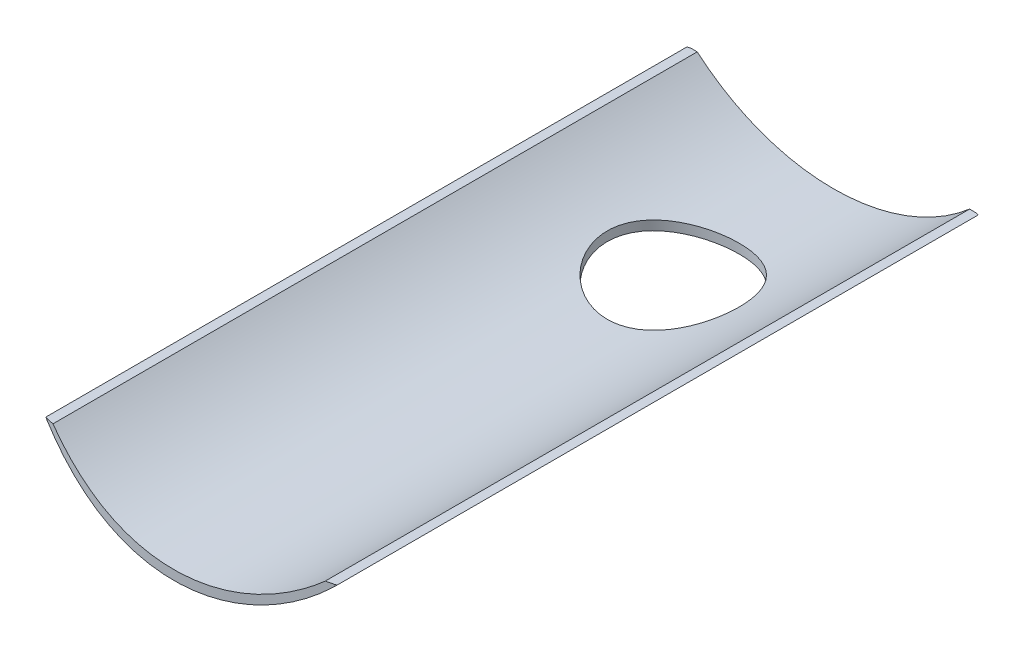
ISO-10303-21;
HEADER;
FILE_DESCRIPTION(('STEP AP214'),'2;1');
FILE_NAME('part.step','',(''),(''),'','','');
FILE_SCHEMA(('AUTOMOTIVE_DESIGN { 1 0 10303 214 1 1 1 1 }'));
ENDSEC;
DATA;
#1=APPLICATION_CONTEXT('core data for automotive mechanical design processes');
#2=APPLICATION_PROTOCOL_DEFINITION('international standard','automotive_design',2000,#1);
#3=PRODUCT_CONTEXT('',#1,'mechanical');
#4=PRODUCT('Part','Part','',(#3));
#5=PRODUCT_RELATED_PRODUCT_CATEGORY('part','',(#4));
#6=PRODUCT_DEFINITION_FORMATION('','',#4);
#7=PRODUCT_DEFINITION_CONTEXT('part definition',#1,'design');
#8=PRODUCT_DEFINITION('design','',#6,#7);
#9=PRODUCT_DEFINITION_SHAPE('','',#8);
#10=(LENGTH_UNIT() NAMED_UNIT(*) SI_UNIT(.MILLI.,.METRE.));
#11=(NAMED_UNIT(*) PLANE_ANGLE_UNIT() SI_UNIT($,.RADIAN.));
#12=(NAMED_UNIT(*) SI_UNIT($,.STERADIAN.) SOLID_ANGLE_UNIT());
#13=UNCERTAINTY_MEASURE_WITH_UNIT(LENGTH_MEASURE(1.E-05),#10,'distance_accuracy_value','');
#14=(GEOMETRIC_REPRESENTATION_CONTEXT(3) GLOBAL_UNCERTAINTY_ASSIGNED_CONTEXT((#13)) GLOBAL_UNIT_ASSIGNED_CONTEXT((#10,
#11,#12)) REPRESENTATION_CONTEXT('',''));
#15=CARTESIAN_POINT('',(0.,0.,0.));
#16=DIRECTION('',(0.,0.,1.));
#17=DIRECTION('',(1.,0.,0.));
#18=AXIS2_PLACEMENT_3D('',#15,#16,#17);
#19=CARTESIAN_POINT('',(0.,-14.5,-9.));
#20=DIRECTION('',(0.,1.,0.));
#21=DIRECTION('',(0.,0.,1.));
#22=AXIS2_PLACEMENT_3D('',#19,#20,#21);
#23=CYLINDRICAL_SURFACE('',#22,3.5);
#24=CARTESIAN_POINT('',(0.,5.32088476061199,-5.5));
#25=CARTESIAN_POINT('',(-0.191526825834939,5.3208855065018,-5.50000093821887));
#26=CARTESIAN_POINT('',(-0.383063894433787,5.32589674768476,-5.51577278943595));
#27=CARTESIAN_POINT('',(-0.760530324365489,5.34539621708635,-5.57827381732667));
#28=CARTESIAN_POINT('',(-0.946458516996928,5.35988640632481,-5.62500939985183));
#29=CARTESIAN_POINT('',(-1.30720975958481,5.39676213968765,-5.74770010129213));
#30=CARTESIAN_POINT('',(-1.48204971827713,5.41913530373675,-5.82360942023109));
#31=CARTESIAN_POINT('',(-1.81651915442775,5.46947108764902,-6.00229603900988));
#32=CARTESIAN_POINT('',(-1.97614613074492,5.49743462428307,-6.10507774653204));
#33=CARTESIAN_POINT('',(-2.28068338402112,5.55697131709403,-6.33799583710389));
#34=CARTESIAN_POINT('',(-2.42504777548865,5.58862436266948,-6.46882545344545));
#35=CARTESIAN_POINT('',(-2.69019437924349,5.65151354058959,-6.75264990998738));
#36=CARTESIAN_POINT('',(-2.81097208119303,5.68274959213322,-6.90564897979135));
#37=CARTESIAN_POINT('',(-3.02850100142779,5.74212871768421,-7.23422438442751));
#38=CARTESIAN_POINT('',(-3.12456597116331,5.77017337954669,-7.41027451729348));
#39=CARTESIAN_POINT('',(-3.2854976617757,5.81879077365608,-7.7770605121669));
#40=CARTESIAN_POINT('',(-3.35037280179967,5.83936552190752,-7.96779239494863));
#41=CARTESIAN_POINT('',(-3.44507790445037,5.86987702786242,-8.35235999308716));
#42=CARTESIAN_POINT('',(-3.47592213511352,5.88012083710118,-8.54592088426397));
#43=CARTESIAN_POINT('',(-3.50485893311831,5.88972175462142,-8.93572046630378));
#44=CARTESIAN_POINT('',(-3.50296042278065,5.88908182869607,-9.13195841311174));
#45=CARTESIAN_POINT('',(-3.46725801547015,5.87725830750563,-9.51311183171549));
#46=CARTESIAN_POINT('',(-3.43474870405648,5.86650255025182,-9.69816408372934));
#47=CARTESIAN_POINT('',(-3.34084851920821,5.8363550911236,-10.0600401906554));
#48=CARTESIAN_POINT('',(-3.27945451614662,5.81696245346413,-10.2368631516504));
#49=CARTESIAN_POINT('',(-3.12862403734678,5.77140204125633,-10.5803228877669));
#50=CARTESIAN_POINT('',(-3.03878467028114,5.74513793258776,-10.7467694049594));
#51=CARTESIAN_POINT('',(-2.83389344514333,5.68883742615724,-11.0626467921691));
#52=CARTESIAN_POINT('',(-2.71883492019947,5.65880003179719,-11.2120731468764));
#53=CARTESIAN_POINT('',(-2.46043996037277,5.59662620637496,-11.496980621167));
#54=CARTESIAN_POINT('',(-2.31603638283043,5.56445715828589,-11.6314885969967));
#55=CARTESIAN_POINT('',(-2.00632231296585,5.5028764827965,-11.874618494683));
#56=CARTESIAN_POINT('',(-1.84101020610866,5.47346506864353,-11.9832384156204));
#57=CARTESIAN_POINT('',(-1.49226692494624,5.42039319930235,-12.1721873106183));
#58=CARTESIAN_POINT('',(-1.30869968860249,5.39678131453562,-12.2522797217186));
#59=CARTESIAN_POINT('',(-0.92977762373222,5.3583197872143,-12.38015718643));
#60=CARTESIAN_POINT('',(-0.734426475031878,5.34346742473038,-12.4279522693944));
#61=CARTESIAN_POINT('',(-0.345738744388238,5.32463809632502,-12.4882103164957));
#62=CARTESIAN_POINT('',(-0.152625670209283,5.32025596712989,-12.5019902890583));
#63=CARTESIAN_POINT('',(0.233176723549936,5.32165993259656,-12.4975462335547));
#64=CARTESIAN_POINT('',(0.425866102194367,5.32744450640182,-12.4793269923124));
#65=CARTESIAN_POINT('',(0.800241621256614,5.34826545972186,-12.4124567399101));
#66=CARTESIAN_POINT('',(0.982083035207409,5.36306226027484,-12.3645932459412));
#67=CARTESIAN_POINT('',(1.33510014929901,5.40017086876392,-12.240757773707));
#68=CARTESIAN_POINT('',(1.50627452090239,5.42248361057255,-12.1647823023499));
#69=CARTESIAN_POINT('',(1.83780297204784,5.47302001676189,-11.9847841167472));
#70=CARTESIAN_POINT('',(1.99778533245517,5.50137607467234,-11.880114954523));
#71=CARTESIAN_POINT('',(2.29835475332182,5.56076067941532,-11.6464735387647));
#72=CARTESIAN_POINT('',(2.43893642815166,5.59178996446827,-11.5174945602401));
#73=CARTESIAN_POINT('',(2.70263090815309,5.65460855108553,-11.2326995335284));
#74=CARTESIAN_POINT('',(2.82480474144142,5.68637768321683,-11.0760076344552));
#75=CARTESIAN_POINT('',(3.0412131827589,5.74576860941254,-10.7436564493548));
#76=CARTESIAN_POINT('',(3.13544814346785,5.77339045582707,-10.5679974027932));
#77=CARTESIAN_POINT('',(3.29273760882299,5.8210573993537,-10.2030003555836));
#78=CARTESIAN_POINT('',(3.35590508690303,5.84112988524341,-10.0137148295575));
#79=CARTESIAN_POINT('',(3.44923514956587,5.8712363487207,-9.62642735578938));
#80=CARTESIAN_POINT('',(3.47941064351736,5.88127425258838,-9.42842884890237));
#81=CARTESIAN_POINT('',(3.50496019909568,5.88975994433679,-9.03916890068653));
#82=CARTESIAN_POINT('',(3.50187738158904,5.88872167117601,-8.84801871546189));
#83=CARTESIAN_POINT('',(3.46473433591919,5.87642397622354,-8.46910415222743));
#84=CARTESIAN_POINT('',(3.43067561152698,5.86516505060851,-8.28133961030783));
#85=CARTESIAN_POINT('',(3.33359017040974,5.83405756828473,-7.91735079192129));
#86=CARTESIAN_POINT('',(3.27101406625686,5.8143428986887,-7.74099401342603));
#87=CARTESIAN_POINT('',(3.1190264053624,5.76858195256711,-7.40114266263042));
#88=CARTESIAN_POINT('',(3.0296093066859,5.74253436867836,-7.23765075538307));
#89=CARTESIAN_POINT('',(2.82231256862552,5.68574778189372,-6.92111702815611));
#90=CARTESIAN_POINT('',(2.70344081872265,5.65486320546763,-6.76875113502704));
#91=CARTESIAN_POINT('',(2.4423440532209,5.5925423105855,-6.48563003715149));
#92=CARTESIAN_POINT('',(2.30011273753868,5.56110584533323,-6.35488068153493));
#93=CARTESIAN_POINT('',(1.99058389206493,5.49995549662576,-6.11429988819391));
#94=CARTESIAN_POINT('',(1.82260452560217,5.47033502827467,-6.00531925836418));
#95=CARTESIAN_POINT('',(1.46977599878047,5.41734087299457,-5.81728399974068));
#96=CARTESIAN_POINT('',(1.28493314997642,5.39396486169343,-5.73821823117257));
#97=CARTESIAN_POINT('',(0.918574914925608,5.35760918433067,-5.61762661120125));
#98=CARTESIAN_POINT('',(0.737932531916937,5.34395872332752,-5.57364584072277));
#99=CARTESIAN_POINT('',(0.371529246064371,5.32559710101201,-5.51483518222499));
#100=CARTESIAN_POINT('',(0.185769441139776,5.32088403714397,-5.49999908998442));
#101=CARTESIAN_POINT('',(0.,5.32088476061199,-5.5));
#102=B_SPLINE_CURVE_WITH_KNOTS('',3,(#24,#25,#26,#27,#28,#29,#30,#31,#32,#33,#34,#35,#36,#37,
#38,#39,#40,#41,#42,#43,#44,#45,#46,#47,#48,#49,#50,#51,#52,#53,#54,#55,#56,#57,#58,#59,#60,#61,
#62,#63,#64,#65,#66,#67,#68,#69,#70,#71,#72,#73,#74,#75,#76,#77,#78,#79,#80,#81,#82,#83,#84,#85,
#86,#87,#88,#89,#90,#91,#92,#93,#94,#95,#96,#97,#98,#99,#100,#101),.UNSPECIFIED.,.T.,.F.,(4,2,2,
2,2,2,2,2,2,2,2,2,2,2,2,2,2,2,2,2,2,2,2,2,2,2,2,2,2,2,2,2,2,2,2,2,2,2,4),(0.,0.573897525283531,
1.14791381696329,1.72103261492896,2.29424547643856,2.88371787577477,3.47330288615985,
4.07782532500147,4.68218449187366,5.26799906885395,5.85365401524862,6.41560266234714,
6.9776122100376,7.54796758594675,8.11847392177906,8.71554143805597,9.31265508744797,
9.91461091567814,10.516379731369,11.0944556671152,11.6724451347368,12.2357021373134,
12.7990291516658,13.3762711074204,13.9536729845596,14.5544775151635,15.1552744613297,
15.7538702187704,16.3522316689345,16.9229543811249,17.4936493882199,18.055623611302,
18.6177139466725,19.2022002793224,19.7868445077928,20.3911397703394,20.9952097818369,
21.5519742178875,22.1086201189442),.UNSPECIFIED.);
#103=CARTESIAN_POINT('',(0.,5.32088476061199,-5.5));
#104=VERTEX_POINT('',#103);
#105=EDGE_CURVE('E50',#104,#104,#102,.T.);
#106=ORIENTED_EDGE('',*,*,#105,.F.);
#107=EDGE_LOOP('',(#106));
#108=FACE_BOUND('',#107,.T.);
#109=CARTESIAN_POINT('',(0.,4.82088476061199,-5.5));
#110=CARTESIAN_POINT('',(0.19143140653732,4.82088530448239,-5.50000064146602));
#111=CARTESIAN_POINT('',(0.382870389835319,4.82594021580945,-5.51575698658184));
#112=CARTESIAN_POINT('',(0.760137629016243,4.84560923280242,-5.57819257379226));
#113=CARTESIAN_POINT('',(0.945964817574961,4.8602251450736,-5.62487766006889));
#114=CARTESIAN_POINT('',(1.30651417107755,4.89742204187737,-5.74742753234194));
#115=CARTESIAN_POINT('',(1.48125343410955,4.91999039288335,-5.82324605311449));
#116=CARTESIAN_POINT('',(1.81553783181465,4.970770034611,-6.00171003162263));
#117=CARTESIAN_POINT('',(1.97508037769681,4.99898228425325,-6.10436004904507));
#118=CARTESIAN_POINT('',(2.27955195665395,5.05907322636459,-6.33703100777899));
#119=CARTESIAN_POINT('',(2.42392636813927,5.09103423377662,-6.46775637021229));
#120=CARTESIAN_POINT('',(2.68911858172509,5.15455102558737,-6.75136804631081));
#121=CARTESIAN_POINT('',(2.80993176539689,5.1861067294091,-6.90425869455573));
#122=CARTESIAN_POINT('',(3.02762678851305,5.24613000452591,-7.23271985378584));
#123=CARTESIAN_POINT('',(3.12380733801851,5.27449635875154,-7.40877542059871));
#124=CARTESIAN_POINT('',(3.28496283833208,5.3236870523994,-7.77561366128622));
#125=CARTESIAN_POINT('',(3.34994639753402,5.34451347197569,-7.96639225565229));
#126=CARTESIAN_POINT('',(3.44481837862392,5.3754035156368,-8.35098737683265));
#127=CARTESIAN_POINT('',(3.47573884277147,5.38578276675724,-8.54452324899824));
#128=CARTESIAN_POINT('',(3.50483184824081,5.3955393758083,-8.93429267567411));
#129=CARTESIAN_POINT('',(3.5030135123191,5.3949197985933,-9.13052546345236));
#130=CARTESIAN_POINT('',(3.46748594662404,5.383026755082,-9.51150309211028));
#131=CARTESIAN_POINT('',(3.43509896015596,5.37219503541428,-9.6963873703625));
#132=CARTESIAN_POINT('',(3.34150124202147,5.34181736549592,-10.0579471764941));
#133=CARTESIAN_POINT('',(3.2802873311514,5.32227045409507,-10.2346217966021));
#134=CARTESIAN_POINT('',(3.12986041911698,5.27633353004357,-10.5778529092077));
#135=CARTESIAN_POINT('',(3.04023933406713,5.24984482159357,-10.7442167744828));
#136=CARTESIAN_POINT('',(2.83582543515429,5.19305296398221,-11.0599733940764));
#137=CARTESIAN_POINT('',(2.72102585732247,5.16274879076515,-11.2093615716312));
#138=CARTESIAN_POINT('',(2.46306689916837,5.09997863352204,-11.4943881013466));
#139=CARTESIAN_POINT('',(2.31881908458038,5.06747835208679,-11.6290357029507));
#140=CARTESIAN_POINT('',(2.00938726007011,5.00524490931578,-11.8724758928125));
#141=CARTESIAN_POINT('',(1.84420156972368,4.9755119704129,-11.9812664038243));
#142=CARTESIAN_POINT('',(1.49561606167117,4.92182851123474,-12.1706130382226));
#143=CARTESIAN_POINT('',(1.3120747937752,4.89792870478278,-12.2509241080853));
#144=CARTESIAN_POINT('',(0.933146449037734,4.85897097587644,-12.3792328727117));
#145=CARTESIAN_POINT('',(0.737763145744489,4.8439102529591,-12.427240802699));
#146=CARTESIAN_POINT('',(0.349099950339404,4.82478227368023,-12.4878725488604));
#147=CARTESIAN_POINT('',(0.156049358786767,4.82029878033,-12.5018368358264));
#148=CARTESIAN_POINT('',(-0.229662258347909,4.82159417609271,-12.4977760923846));
#149=CARTESIAN_POINT('',(-0.422323338959801,4.82737149686179,-12.4797559507296));
#150=CARTESIAN_POINT('',(-0.796558045455255,4.84826542936773,-12.413309579564));
#151=CARTESIAN_POINT('',(-0.978289788620628,4.86313456090024,-12.3656885388519));
#152=CARTESIAN_POINT('',(-1.33112677201221,4.90046146949166,-12.242381917253));
#153=CARTESIAN_POINT('',(-1.50223068147821,4.92292019462016,-12.1666928300738));
#154=CARTESIAN_POINT('',(-1.83371445384514,4.97382409496691,-11.9872889659293));
#155=CARTESIAN_POINT('',(-1.99371941373681,5.0024048598932,-11.8829210260551));
#156=CARTESIAN_POINT('',(-2.29439021003751,5.06229254641561,-11.6499006650575));
#157=CARTESIAN_POINT('',(-2.43505057798869,5.09360023480808,-11.5212414013909));
#158=CARTESIAN_POINT('',(-2.69908492803031,5.15704703928084,-11.2369844843053));
#159=CARTESIAN_POINT('',(-2.821502963194,5.18916696474995,-11.0804925464064));
#160=CARTESIAN_POINT('',(-3.03843621942246,5.24925711546907,-10.7484907097825));
#161=CARTESIAN_POINT('',(-3.13295170356341,5.27722737984246,-10.572980990386));
#162=CARTESIAN_POINT('',(-3.29084830544772,5.32555006222802,-10.2081687740716));
#163=CARTESIAN_POINT('',(-3.35433463547186,5.3459281667198,-10.0189154217402));
#164=CARTESIAN_POINT('',(-3.44829318037467,5.37655023768649,-9.6316162582365));
#165=CARTESIAN_POINT('',(-3.47877863671414,5.38679826866704,-9.43357400680224));
#166=CARTESIAN_POINT('',(-3.5048937312197,5.39556449248371,-9.04434580437698));
#167=CARTESIAN_POINT('',(-3.50209700848726,5.39461227804356,-8.85327609800927));
#168=CARTESIAN_POINT('',(-3.46554829135386,5.38237874258789,-8.47447471010425));
#169=CARTESIAN_POINT('',(-3.43179785521035,5.37109794152931,-8.28674286101905));
#170=CARTESIAN_POINT('',(-3.33537201133704,5.33985586403609,-7.92288833091721));
#171=CARTESIAN_POINT('',(-3.27316469284128,5.32003535351685,-7.74662859048841));
#172=CARTESIAN_POINT('',(-3.12196237615671,5.27398808532218,-7.40690873123454));
#173=CARTESIAN_POINT('',(-3.03296177068228,5.24775998688675,-7.24345130070277));
#174=CARTESIAN_POINT('',(-2.82648560036826,5.19052749329312,-6.92680552509836));
#175=CARTESIAN_POINT('',(-2.70800259892487,5.15937265581369,-6.77430139245789));
#176=CARTESIAN_POINT('',(-2.44767652219913,5.09646967073046,-6.49083083667719));
#177=CARTESIAN_POINT('',(-2.30582709449918,5.06472136387206,-6.3598702897994));
#178=CARTESIAN_POINT('',(-1.99690804793316,5.00289392155277,-6.11867033919153));
#179=CARTESIAN_POINT('',(-1.82913699814338,4.97291020360634,-6.00930201971378));
#180=CARTESIAN_POINT('',(-1.47663787901487,4.91921688853666,-5.82045872368926));
#181=CARTESIAN_POINT('',(-1.29191581886499,4.89550507948593,-5.74097320413368));
#182=CARTESIAN_POINT('',(-0.924595398808691,4.85845713968989,-5.61920081125796));
#183=CARTESIAN_POINT('',(-0.74281532397621,4.84449303971511,-5.57463347090965));
#184=CARTESIAN_POINT('',(-0.374025126406755,4.82570760344303,-5.51503604378572));
#185=CARTESIAN_POINT('',(-0.187016178846452,4.82088422928556,-5.49999937332893));
#186=CARTESIAN_POINT('',(0.,4.82088476061199,-5.5));
#187=B_SPLINE_CURVE_WITH_KNOTS('',3,(#109,#110,#111,#112,#113,#114,#115,#116,#117,#118,#119,
#120,#121,#122,#123,#124,#125,#126,#127,#128,#129,#130,#131,#132,#133,#134,#135,#136,#137,#138,
#139,#140,#141,#142,#143,#144,#145,#146,#147,#148,#149,#150,#151,#152,#153,#154,#155,#156,#157,
#158,#159,#160,#161,#162,#163,#164,#165,#166,#167,#168,#169,#170,#171,#172,#173,#174,#175,#176,
#177,#178,#179,#180,#181,#182,#183,#184,#185,#186),.UNSPECIFIED.,.T.,.F.,(4,2,2,2,2,2,2,2,2,2,2,
2,2,2,2,2,2,2,2,2,2,2,2,2,2,2,2,2,2,2,2,2,2,2,2,2,2,2,4),(0.,0.57360656811535,1.14732155375981,
1.72012919423387,2.29303423976353,2.88247314904556,3.47202748318688,4.07685958214657,
4.6815246896821,5.26731778668069,5.85294765335188,6.41435357676066,6.97582142983933,
7.54575145302607,8.11583477057582,8.713008812114,9.31023081180442,9.91247361651073,
10.5145255111073,11.0924587010871,11.670303562796,12.233079312015,12.795925387519,
13.3728385829561,13.9499145302926,14.5508655494821,15.1518109024893,15.7507042108089,
16.3493571265514,16.9198217384034,17.4902576337674,18.0516302589405,18.6131204496627,
19.1973558512978,19.7817503466198,20.3863129132675,20.9906619824036,21.5511637022355,
22.1115404474654),.UNSPECIFIED.);
#188=CARTESIAN_POINT('',(0.,4.82088476061199,-5.5));
#189=VERTEX_POINT('',#188);
#190=EDGE_CURVE('E203',#189,#189,#187,.T.);
#191=ORIENTED_EDGE('',*,*,#190,.F.);
#192=EDGE_LOOP('',(#191));
#193=FACE_BOUND('',#192,.T.);
#194=ADVANCED_FACE('F45',(#108,#193),#23,.F.);
#195=CARTESIAN_POINT('',(0.,15.7960136016071,22.));
#196=DIRECTION('',(0.,0.,-1.));
#197=DIRECTION('',(-1.,0.,0.));
#198=AXIS2_PLACEMENT_3D('',#195,#196,#197);
#199=CYLINDRICAL_SURFACE('',#198,10.9751288409951);
#200=DIRECTION('',(0.,0.,-1.));
#201=VECTOR('',#200,1.);
#202=CARTESIAN_POINT('',(-7.72499999999999,8.,22.));
#203=LINE('',#202,#201);
#204=CARTESIAN_POINT('',(-7.72499999999999,8.,16.5551947380919));
#205=VERTEX_POINT('',#204);
#206=CARTESIAN_POINT('',(-7.725,8.,-17.4465142774873));
#207=VERTEX_POINT('',#206);
#208=EDGE_CURVE('E148',#205,#207,#203,.T.);
#209=ORIENTED_EDGE('',*,*,#208,.T.);
#210=CARTESIAN_POINT('',(-7.5,7.78330787404896,-17.5));
#211=CARTESIAN_POINT('',(-7.51944719464652,7.80150949658212,-17.4999953004398));
#212=CARTESIAN_POINT('',(-7.53882618738081,7.81978254185645,-17.4988654953529));
#213=CARTESIAN_POINT('',(-7.57717432151773,7.85620429238337,-17.4943836605344));
#214=CARTESIAN_POINT('',(-7.5961454182387,7.87435293587609,-17.4910478449557));
#215=CARTESIAN_POINT('',(-7.63369223155576,7.91052849504138,-17.4821811387675));
#216=CARTESIAN_POINT('',(-7.65226792008459,7.92855540201114,-17.476650092878));
#217=CARTESIAN_POINT('',(-7.6890139213376,7.96446279159413,-17.4633109194193));
#218=CARTESIAN_POINT('',(-7.70718026850482,7.9823412347136,-17.4554864106548));
#219=CARTESIAN_POINT('',(-7.725,7.99999999999999,-17.4465142774873));
#220=B_SPLINE_CURVE_WITH_KNOTS('',3,(#210,#211,#212,#213,#214,#215,#216,#217,#218,#219),
.UNSPECIFIED.,.F.,.F.,(4,2,2,2,4),(0.,0.0798835149737886,0.159186317251592,0.238494730033664,
0.3183840171239),.UNSPECIFIED.);
#221=CARTESIAN_POINT('',(-7.5,7.78330787404896,-17.5));
#222=VERTEX_POINT('',#221);
#223=EDGE_CURVE('E181',#222,#207,#220,.T.);
#224=ORIENTED_EDGE('',*,*,#223,.F.);
#225=CARTESIAN_POINT('',(0.,15.7960136016071,-17.5));
#226=DIRECTION('',(0.,0.,1.));
#227=DIRECTION('',(1.,0.,0.));
#228=AXIS2_PLACEMENT_3D('',#225,#226,#227);
#229=CIRCLE('',#228,10.9751288409951);
#230=CARTESIAN_POINT('',(7.5,7.78330787404897,-17.5));
#231=VERTEX_POINT('',#230);
#232=EDGE_CURVE('E178',#222,#231,#229,.T.);
#233=ORIENTED_EDGE('',*,*,#232,.T.);
#234=CARTESIAN_POINT('',(7.72499999999999,8.,-17.4465142774873));
#235=CARTESIAN_POINT('',(7.70718026850482,7.9823412347136,-17.4554864106548));
#236=CARTESIAN_POINT('',(7.6890139213376,7.96446279159414,-17.4633109194193));
#237=CARTESIAN_POINT('',(7.65226792008458,7.92855540201115,-17.476650092878));
#238=CARTESIAN_POINT('',(7.63369223155575,7.91052849504138,-17.4821811387675));
#239=CARTESIAN_POINT('',(7.5961454182387,7.87435293587609,-17.4910478449557));
#240=CARTESIAN_POINT('',(7.57717432151772,7.85620429238338,-17.4943836605344));
#241=CARTESIAN_POINT('',(7.5388261873808,7.81978254185645,-17.4988654953529));
#242=CARTESIAN_POINT('',(7.51944719464651,7.80150949658213,-17.4999953004398));
#243=CARTESIAN_POINT('',(7.49999999999999,7.78330787404897,-17.5));
#244=B_SPLINE_CURVE_WITH_KNOTS('',3,(#234,#235,#236,#237,#238,#239,#240,#241,#242,#243),
.UNSPECIFIED.,.F.,.F.,(4,2,2,2,4),(0.,0.0798892870902371,0.159197699872309,0.238500502150111,
0.318384017123901),.UNSPECIFIED.);
#245=CARTESIAN_POINT('',(7.72499999999999,8.,-17.4465142774873));
#246=VERTEX_POINT('',#245);
#247=EDGE_CURVE('E231',#246,#231,#244,.T.);
#248=ORIENTED_EDGE('',*,*,#247,.F.);
#249=DIRECTION('',(0.,0.,-1.));
#250=VECTOR('',#249,1.);
#251=CARTESIAN_POINT('',(7.72500000000001,8.,22.));
#252=LINE('',#251,#250);
#253=CARTESIAN_POINT('',(7.72500000000001,8.,16.5551947380919));
#254=VERTEX_POINT('',#253);
#255=EDGE_CURVE('E136',#254,#246,#252,.T.);
#256=ORIENTED_EDGE('',*,*,#255,.F.);
#257=CARTESIAN_POINT('',(7.6171875,7.89462716210885,16.5947535928015));
#258=CARTESIAN_POINT('',(7.63568150610906,7.91246140250281,16.5903167614611));
#259=CARTESIAN_POINT('',(7.65391288417226,7.93015959253265,16.5848017745608));
#260=CARTESIAN_POINT('',(7.68985038417122,7.96528387182916,16.5716154896533));
#261=CARTESIAN_POINT('',(7.70755650610802,7.98270996109637,16.5639441916504));
#262=CARTESIAN_POINT('',(7.72500000000001,8.,16.5551947380919));
#263=B_SPLINE_CURVE_WITH_KNOTS('',3,(#257,#258,#259,#260,#261,#262),.UNSPECIFIED.,.F.,.F.,(4,2,
4),(0.,0.0780013936563805,0.156002787157712),.UNSPECIFIED.);
#264=CARTESIAN_POINT('',(7.6171875,7.89462716210885,16.5947535928015));
#265=VERTEX_POINT('',#264);
#266=EDGE_CURVE('E192',#265,#254,#263,.T.);
#267=ORIENTED_EDGE('',*,*,#266,.F.);
#268=CARTESIAN_POINT('',(7.61718749999999,7.89462716210885,16.5947535928015));
#269=CARTESIAN_POINT('',(7.39792719125212,7.68322673831301,16.6476291749199));
#270=CARTESIAN_POINT('',(7.1697958519958,7.48093720283657,16.700201282834));
#271=CARTESIAN_POINT('',(6.69720156006887,7.09579702471757,16.803392180274));
#272=CARTESIAN_POINT('',(6.45273595918425,6.91294954665779,16.8540106509549));
#273=CARTESIAN_POINT('',(5.94860728198732,6.56774147266081,16.9519975777249));
#274=CARTESIAN_POINT('',(5.68892364614475,6.4054095728351,16.9993614401232));
#275=CARTESIAN_POINT('',(5.15630076288902,6.1027259982858,17.089491783541));
#276=CARTESIAN_POINT('',(4.88336237166681,5.9623729063087,17.1322585609372));
#277=CARTESIAN_POINT('',(4.32549148765708,5.70452385361387,17.2121041355063));
#278=CARTESIAN_POINT('',(4.04053880500545,5.58706839898629,17.2491728286687));
#279=CARTESIAN_POINT('',(3.46105139413115,5.3763389572589,17.3165002839755));
#280=CARTESIAN_POINT('',(3.16651707103253,5.2830639492705,17.3467593336131));
#281=CARTESIAN_POINT('',(2.57028464884705,5.12163405849708,17.3995850121112));
#282=CARTESIAN_POINT('',(2.2685941299159,5.05345375725707,17.4221594229991));
#283=CARTESIAN_POINT('',(1.66004569416219,4.94274974230408,17.4590072521946));
#284=CARTESIAN_POINT('',(1.35318799440774,4.90022495357888,17.4732810183133));
#285=CARTESIAN_POINT('',(0.747509854431837,4.84229428789005,17.4927653788695));
#286=CARTESIAN_POINT('',(0.44878469046765,4.82599012278121,17.4982761061578));
#287=CARTESIAN_POINT('',(-0.149035833103814,4.81782615269546,17.5010327411121));
#288=CARTESIAN_POINT('',(-0.448131185997268,4.82596591070833,17.4982787965345));
#289=CARTESIAN_POINT('',(-1.04453804775387,4.86661493259549,17.4845800092121));
#290=CARTESIAN_POINT('',(-1.34184913104644,4.89912979423219,17.4736332849898));
#291=CARTESIAN_POINT('',(-1.93243417180413,4.98822323132039,17.4438456313445));
#292=CARTESIAN_POINT('',(-2.22570819635549,5.0448014063978,17.4250048332661));
#293=CARTESIAN_POINT('',(-2.80048459921199,5.1801662965745,17.3803762509652));
#294=CARTESIAN_POINT('',(-3.08210498647436,5.25849986974816,17.3547306446049));
#295=CARTESIAN_POINT('',(-3.63761152304748,5.43713476589373,17.2969933079259));
#296=CARTESIAN_POINT('',(-3.91149743011001,5.5374367760697,17.2649013759595));
#297=CARTESIAN_POINT('',(-4.44979022235516,5.75920471753079,17.1950774387654));
#298=CARTESIAN_POINT('',(-4.71419799715031,5.88066865626394,17.1573459645897));
#299=CARTESIAN_POINT('',(-5.23189777960774,6.14380910690928,17.0771866388374));
#300=CARTESIAN_POINT('',(-5.48519179536941,6.28548194752882,17.0347596405961));
#301=CARTESIAN_POINT('',(-6.07265899182309,6.6453082441187,16.9294878829918));
#302=CARTESIAN_POINT('',(-6.40128951820383,6.87214978680867,16.8649792752311));
#303=CARTESIAN_POINT('',(-6.87341833705092,7.23744159881221,16.765264529265));
#304=CARTESIAN_POINT('',(-7.02720384200259,7.36326017663096,16.7315640500677));
#305=CARTESIAN_POINT('',(-7.32762665638168,7.62296521881245,16.6635370333031));
#306=CARTESIAN_POINT('',(-7.4742648254099,7.75685070862559,16.6292105717076));
#307=CARTESIAN_POINT('',(-7.6171875,7.89462716210887,16.5947535928015));
#308=B_SPLINE_CURVE_WITH_KNOTS('',3,(#268,#269,#270,#271,#272,#273,#274,#275,#276,#277,#278,
#279,#280,#281,#282,#283,#284,#285,#286,#287,#288,#289,#290,#291,#292,#293,#294,#295,#296,#297,
#298,#299,#300,#301,#302,#303,#304,#305,#306,#307),.UNSPECIFIED.,.F.,.F.,(4,2,2,2,2,2,2,2,2,2,2,
2,2,2,2,2,2,2,2,4),(0.,0.927144874447951,1.85444042994978,2.78301901046586,3.711537689023,
4.64168430867852,5.57179165152536,6.50095427797665,7.43007796813378,8.32663540730038,
9.22317681784374,10.1199241829498,11.0166566282341,11.8959556305457,12.7752821425148,
13.6545259040968,14.5336101389584,15.7443778002399,16.3487403630764,16.9530300597484),.UNSPECIFIED.);
#309=CARTESIAN_POINT('',(-7.6171875,7.89462716210887,16.5947535928015));
#310=VERTEX_POINT('',#309);
#311=EDGE_CURVE('E188',#265,#310,#308,.T.);
#312=ORIENTED_EDGE('',*,*,#311,.T.);
#313=CARTESIAN_POINT('',(-7.72499999999999,8.,16.5551947380919));
#314=CARTESIAN_POINT('',(-7.707556506108,7.98270996109637,16.5639441916504));
#315=CARTESIAN_POINT('',(-7.6898503841712,7.96528387182916,16.5716154896532));
#316=CARTESIAN_POINT('',(-7.65391288417229,7.93015959253269,16.5848017745609));
#317=CARTESIAN_POINT('',(-7.63568150610912,7.91246140250289,16.5903167614613));
#318=CARTESIAN_POINT('',(-7.61718750000011,7.89462716210897,16.5947535928019));
#319=B_SPLINE_CURVE_WITH_KNOTS('',3,(#313,#314,#315,#316,#317,#318),.UNSPECIFIED.,.F.,.F.,(4,2,
4),(0.,0.0780013935012994,0.15600278715763),.UNSPECIFIED.);
#320=EDGE_CURVE('E187',#205,#310,#319,.T.);
#321=ORIENTED_EDGE('',*,*,#320,.F.);
#322=EDGE_LOOP('',(#209,#224,#233,#248,#256,#267,#312,#321));
#323=FACE_BOUND('',#322,.T.);
#324=ORIENTED_EDGE('',*,*,#190,.T.);
#325=EDGE_LOOP('',(#324));
#326=FACE_BOUND('',#325,.T.);
#327=ADVANCED_FACE('F220',(#323,#326),#199,.T.);
#328=CARTESIAN_POINT('',(0.,16.4025811716041,22.));
#329=DIRECTION('',(0.,0.,-1.));
#330=DIRECTION('',(-1.,0.,0.));
#331=AXIS2_PLACEMENT_3D('',#328,#329,#330);
#332=CYLINDRICAL_SURFACE('',#331,11.0816964109921);
#333=ORIENTED_EDGE('',*,*,#105,.T.);
#334=EDGE_LOOP('',(#333));
#335=FACE_BOUND('',#334,.T.);
#336=CARTESIAN_POINT('',(-7.22499999999999,8.,16.6867381565222));
#337=CARTESIAN_POINT('',(-6.99363836248212,7.80103553370156,16.7395089399272));
#338=CARTESIAN_POINT('',(-6.75391625772666,7.61155827082727,16.791486909168));
#339=CARTESIAN_POINT('',(-6.25920711160911,7.25274005987758,16.8925661975117));
#340=CARTESIAN_POINT('',(-6.00421711074757,7.083403034868,16.9416669552281));
#341=CARTESIAN_POINT('',(-5.48017034381657,6.7658940838478,17.0357419098411));
#342=CARTESIAN_POINT('',(-5.2110952830547,6.61775066661316,17.0807105198086));
#343=CARTESIAN_POINT('',(-4.66090363128022,6.34403447362103,17.165251512395));
#344=CARTESIAN_POINT('',(-4.37978795280467,6.21845999113894,17.2048243030059));
#345=CARTESIAN_POINT('',(-3.80679958701015,5.99068899593702,17.2775747274781));
#346=CARTESIAN_POINT('',(-3.51490744348164,5.88853743525519,17.310740045576));
#347=CARTESIAN_POINT('',(-2.92292048301546,5.70883499549184,17.3696617125498));
#348=CARTESIAN_POINT('',(-2.62282599107927,5.63128314322699,17.3954183545149));
#349=CARTESIAN_POINT('',(-2.0169591280816,5.50158408499972,17.4387731972729));
#350=CARTESIAN_POINT('',(-1.71119338535313,5.44940894993468,17.4563803661739));
#351=CARTESIAN_POINT('',(-1.09599947103311,5.37085744970874,17.4829734053904));
#352=CARTESIAN_POINT('',(-0.786571452352543,5.3444800112359,17.4919596343795));
#353=CARTESIAN_POINT('',(-0.177292576637524,5.31825554007679,17.5008944507344));
#354=CARTESIAN_POINT('',(0.122515713486966,5.31751488150248,17.501147452895));
#355=CARTESIAN_POINT('',(0.721097196904786,5.34031582470904,17.4933778339133));
#356=CARTESIAN_POINT('',(1.01987040507587,5.3638570760086,17.4853553322183));
#357=CARTESIAN_POINT('',(1.61437619254359,5.43501693230141,17.4612438466623));
#358=CARTESIAN_POINT('',(1.91010692405005,5.48264937858522,17.445150225687));
#359=CARTESIAN_POINT('',(2.49624110350485,5.60155353734074,17.4053246920811));
#360=CARTESIAN_POINT('',(2.78664467351093,5.67282470747825,17.3815929546893));
#361=CARTESIAN_POINT('',(3.3572069297834,5.83752422960513,17.3273947969685));
#362=CARTESIAN_POINT('',(3.63743992821765,5.93071901052746,17.2969995861598));
#363=CARTESIAN_POINT('',(4.18895071984974,6.13887990157052,17.2301079689331));
#364=CARTESIAN_POINT('',(4.46022825908415,6.25384662848928,17.193611389667));
#365=CARTESIAN_POINT('',(4.99189702737429,6.50453769397453,17.1154651672935));
#366=CARTESIAN_POINT('',(5.25229869957793,6.64024150853425,17.0738206269517));
#367=CARTESIAN_POINT('',(5.76090973501409,6.93148064888017,16.9863794975371));
#368=CARTESIAN_POINT('',(6.00912388599711,7.08700809938991,16.9405845593568));
#369=CARTESIAN_POINT('',(6.42006126769792,7.36770686373317,16.8600480299321));
#370=CARTESIAN_POINT('',(6.58621697803349,7.48811144386677,16.8260796804306));
#371=CARTESIAN_POINT('',(6.9111488808225,7.73759993003554,16.7571029619062));
#372=CARTESIAN_POINT('',(7.06993824413132,7.86666724926295,16.7220966482499));
#373=CARTESIAN_POINT('',(7.22500000000001,8.,16.6867381565222));
#374=B_SPLINE_CURVE_WITH_KNOTS('',3,(#336,#337,#338,#339,#340,#341,#342,#343,#344,#345,#346,
#347,#348,#349,#350,#351,#352,#353,#354,#355,#356,#357,#358,#359,#360,#361,#362,#363,#364,#365,
#366,#367,#368,#369,#370,#371,#372,#373),.UNSPECIFIED.,.F.,.F.,(4,2,2,2,2,2,2,2,2,2,2,2,2,2,2,2,
2,2,4),(0.,0.928798567264107,1.85777775756837,2.78799505391547,3.71814197505902,4.6500593168988,
5.5819397867746,6.51279231390401,7.44360611131044,8.34194043716488,9.24026179678287,
10.1390998628336,11.0379173086123,11.9275610013718,12.81722990146,13.7060239100576,
14.5944659242461,15.2181322278963,15.8406366871965),.UNSPECIFIED.);
#375=CARTESIAN_POINT('',(-7.22499999999999,8.,16.6867381565222));
#376=VERTEX_POINT('',#375);
#377=CARTESIAN_POINT('',(7.22500000000001,8.,16.6867381565222));
#378=VERTEX_POINT('',#377);
#379=EDGE_CURVE('E119',#376,#378,#374,.T.);
#380=ORIENTED_EDGE('',*,*,#379,.T.);
#381=DIRECTION('',(0.,0.,-1.));
#382=VECTOR('',#381,1.);
#383=CARTESIAN_POINT('',(7.22500000000001,8.,22.));
#384=LINE('',#383,#382);
#385=CARTESIAN_POINT('',(7.22499999999999,8.,-17.5));
#386=VERTEX_POINT('',#385);
#387=EDGE_CURVE('E123',#378,#386,#384,.T.);
#388=ORIENTED_EDGE('',*,*,#387,.T.);
#389=CARTESIAN_POINT('',(0.,16.4025811716041,-17.5));
#390=DIRECTION('',(0.,0.,1.));
#391=DIRECTION('',(1.,0.,0.));
#392=AXIS2_PLACEMENT_3D('',#389,#390,#391);
#393=CIRCLE('',#392,11.0816964109921);
#394=CARTESIAN_POINT('',(-7.225,8.,-17.5));
#395=VERTEX_POINT('',#394);
#396=EDGE_CURVE('E68',#386,#395,#393,.F.);
#397=ORIENTED_EDGE('',*,*,#396,.T.);
#398=DIRECTION('',(0.,0.,-1.));
#399=VECTOR('',#398,1.);
#400=CARTESIAN_POINT('',(-7.22499999999999,8.,22.));
#401=LINE('',#400,#399);
#402=EDGE_CURVE('E116',#376,#395,#401,.T.);
#403=ORIENTED_EDGE('',*,*,#402,.F.);
#404=EDGE_LOOP('',(#380,#388,#397,#403));
#405=FACE_BOUND('',#404,.T.);
#406=ADVANCED_FACE('F118',(#335,#405),#332,.F.);
#407=CARTESIAN_POINT('',(0.,8.,-15.));
#408=DIRECTION('',(0.,1.,0.));
#409=DIRECTION('',(0.,0.,1.));
#410=AXIS2_PLACEMENT_3D('',#407,#408,#409);
#411=PLANE('',#410);
#412=DIRECTION('',(-1.,0.,0.));
#413=VECTOR('',#412,1.);
#414=CARTESIAN_POINT('',(8.,8.,-17.5));
#415=LINE('',#414,#413);
#416=CARTESIAN_POINT('',(7.5,8.,-17.5));
#417=VERTEX_POINT('',#416);
#418=EDGE_CURVE('E146',#417,#386,#415,.T.);
#419=ORIENTED_EDGE('',*,*,#418,.T.);
#420=ORIENTED_EDGE('',*,*,#387,.F.);
#421=CARTESIAN_POINT('',(0.,8.,-15.));
#422=DIRECTION('',(0.,1.,0.));
#423=DIRECTION('',(0.,0.,1.));
#424=AXIS2_PLACEMENT_3D('',#421,#422,#423);
#425=CIRCLE('',#424,32.5);
#426=CARTESIAN_POINT('',(7.6171875,8.,16.5947535928015));
#427=VERTEX_POINT('',#426);
#428=EDGE_CURVE('E134',#378,#427,#425,.T.);
#429=ORIENTED_EDGE('',*,*,#428,.T.);
#430=CARTESIAN_POINT('',(7.5,8.,16.1086804606046));
#431=DIRECTION('',(0.,1.,0.));
#432=DIRECTION('',(0.,0.,1.));
#433=AXIS2_PLACEMENT_3D('',#430,#431,#432);
#434=CIRCLE('',#433,0.5);
#435=EDGE_CURVE('E166',#427,#254,#434,.T.);
#436=ORIENTED_EDGE('',*,*,#435,.T.);
#437=ORIENTED_EDGE('',*,*,#255,.T.);
#438=CARTESIAN_POINT('',(7.5,8.,-17.));
#439=DIRECTION('',(0.,1.,0.));
#440=DIRECTION('',(0.,0.,1.));
#441=AXIS2_PLACEMENT_3D('',#438,#439,#440);
#442=CIRCLE('',#441,0.5);
#443=EDGE_CURVE('E163',#246,#417,#442,.T.);
#444=ORIENTED_EDGE('',*,*,#443,.T.);
#445=EDGE_LOOP('',(#419,#420,#429,#436,#437,#444));
#446=FACE_BOUND('',#445,.T.);
#447=ADVANCED_FACE('F199',(#446),#411,.T.);
#448=CARTESIAN_POINT('',(7.5,8.,-17.));
#449=DIRECTION('',(0.,-1.,0.));
#450=DIRECTION('',(0.,0.,-1.));
#451=AXIS2_PLACEMENT_3D('',#448,#449,#450);
#452=CYLINDRICAL_SURFACE('',#451,0.5);
#453=ORIENTED_EDGE('',*,*,#443,.F.);
#454=ORIENTED_EDGE('',*,*,#247,.T.);
#455=DIRECTION('',(0.,-1.,0.));
#456=VECTOR('',#455,1.);
#457=CARTESIAN_POINT('',(7.5,8.,-17.5));
#458=LINE('',#457,#456);
#459=EDGE_CURVE('E12',#417,#231,#458,.T.);
#460=ORIENTED_EDGE('',*,*,#459,.F.);
#461=EDGE_LOOP('',(#453,#454,#460));
#462=FACE_BOUND('',#461,.T.);
#463=ADVANCED_FACE('F276',(#462),#452,.T.);
#464=CARTESIAN_POINT('',(7.5,8.,16.1086804606046));
#465=DIRECTION('',(0.,-1.,0.));
#466=DIRECTION('',(0.,0.,-1.));
#467=AXIS2_PLACEMENT_3D('',#464,#465,#466);
#468=CYLINDRICAL_SURFACE('',#467,0.5);
#469=DIRECTION('',(0.,-1.,0.));
#470=VECTOR('',#469,1.);
#471=CARTESIAN_POINT('',(7.6171875,8.,16.5947535928015));
#472=LINE('',#471,#470);
#473=EDGE_CURVE('E154',#265,#427,#472,.F.);
#474=ORIENTED_EDGE('',*,*,#473,.F.);
#475=ORIENTED_EDGE('',*,*,#266,.T.);
#476=ORIENTED_EDGE('',*,*,#435,.F.);
#477=EDGE_LOOP('',(#474,#475,#476));
#478=FACE_BOUND('',#477,.T.);
#479=ADVANCED_FACE('F196',(#478),#468,.T.);
#480=CARTESIAN_POINT('',(-7.6171875,8.,16.5947535928015));
#481=VERTEX_POINT('',#480);
#482=EDGE_CURVE('E131',#481,#376,#425,.T.);
#483=ORIENTED_EDGE('',*,*,#482,.T.);
#484=ORIENTED_EDGE('',*,*,#402,.T.);
#485=CARTESIAN_POINT('',(-7.5,8.,-17.5));
#486=VERTEX_POINT('',#485);
#487=EDGE_CURVE('E75',#395,#486,#415,.T.);
#488=ORIENTED_EDGE('',*,*,#487,.T.);
#489=CARTESIAN_POINT('',(-7.5,8.,-17.));
#490=DIRECTION('',(0.,1.,0.));
#491=DIRECTION('',(0.,0.,1.));
#492=AXIS2_PLACEMENT_3D('',#489,#490,#491);
#493=CIRCLE('',#492,0.5);
#494=EDGE_CURVE('E160',#486,#207,#493,.T.);
#495=ORIENTED_EDGE('',*,*,#494,.T.);
#496=ORIENTED_EDGE('',*,*,#208,.F.);
#497=CARTESIAN_POINT('',(-7.5,8.,16.1086804606046));
#498=DIRECTION('',(0.,1.,0.));
#499=DIRECTION('',(0.,0.,1.));
#500=AXIS2_PLACEMENT_3D('',#497,#498,#499);
#501=CIRCLE('',#500,0.5);
#502=EDGE_CURVE('E141',#205,#481,#501,.T.);
#503=ORIENTED_EDGE('',*,*,#502,.T.);
#504=EDGE_LOOP('',(#483,#484,#488,#495,#496,#503));
#505=FACE_BOUND('',#504,.T.);
#506=ADVANCED_FACE('F138',(#505),#411,.T.);
#507=CARTESIAN_POINT('',(-7.5,8.,-17.));
#508=DIRECTION('',(0.,-1.,0.));
#509=DIRECTION('',(0.,0.,-1.));
#510=AXIS2_PLACEMENT_3D('',#507,#508,#509);
#511=CYLINDRICAL_SURFACE('',#510,0.5);
#512=DIRECTION('',(0.,-1.,0.));
#513=VECTOR('',#512,1.);
#514=CARTESIAN_POINT('',(-7.5,8.,-17.5));
#515=LINE('',#514,#513);
#516=EDGE_CURVE('E61',#222,#486,#515,.F.);
#517=ORIENTED_EDGE('',*,*,#516,.F.);
#518=ORIENTED_EDGE('',*,*,#223,.T.);
#519=ORIENTED_EDGE('',*,*,#494,.F.);
#520=EDGE_LOOP('',(#517,#518,#519));
#521=FACE_BOUND('',#520,.T.);
#522=ADVANCED_FACE('F47',(#521),#511,.T.);
#523=CARTESIAN_POINT('',(-7.5,8.,16.1086804606046));
#524=DIRECTION('',(0.,-1.,0.));
#525=DIRECTION('',(0.,0.,-1.));
#526=AXIS2_PLACEMENT_3D('',#523,#524,#525);
#527=CYLINDRICAL_SURFACE('',#526,0.5);
#528=ORIENTED_EDGE('',*,*,#502,.F.);
#529=ORIENTED_EDGE('',*,*,#320,.T.);
#530=DIRECTION('',(0.,-1.,0.));
#531=VECTOR('',#530,1.);
#532=CARTESIAN_POINT('',(-7.6171875,8.,16.5947535928015));
#533=LINE('',#532,#531);
#534=EDGE_CURVE('E157',#481,#310,#533,.T.);
#535=ORIENTED_EDGE('',*,*,#534,.F.);
#536=EDGE_LOOP('',(#528,#529,#535));
#537=FACE_BOUND('',#536,.T.);
#538=ADVANCED_FACE('F186',(#537),#527,.T.);
#539=CARTESIAN_POINT('',(8.,8.,-17.5));
#540=DIRECTION('',(0.,0.,1.));
#541=DIRECTION('',(1.,0.,0.));
#542=AXIS2_PLACEMENT_3D('',#539,#540,#541);
#543=PLANE('',#542);
#544=ORIENTED_EDGE('',*,*,#232,.F.);
#545=ORIENTED_EDGE('',*,*,#516,.T.);
#546=ORIENTED_EDGE('',*,*,#487,.F.);
#547=ORIENTED_EDGE('',*,*,#396,.F.);
#548=ORIENTED_EDGE('',*,*,#418,.F.);
#549=ORIENTED_EDGE('',*,*,#459,.T.);
#550=EDGE_LOOP('',(#544,#545,#546,#547,#548,#549));
#551=FACE_BOUND('',#550,.T.);
#552=ADVANCED_FACE('F177',(#551),#543,.F.);
#553=CARTESIAN_POINT('',(0.,8.,-15.));
#554=DIRECTION('',(0.,-1.,0.));
#555=DIRECTION('',(0.,0.,-1.));
#556=AXIS2_PLACEMENT_3D('',#553,#554,#555);
#557=CYLINDRICAL_SURFACE('',#556,32.5);
#558=ORIENTED_EDGE('',*,*,#311,.F.);
#559=ORIENTED_EDGE('',*,*,#473,.T.);
#560=ORIENTED_EDGE('',*,*,#428,.F.);
#561=ORIENTED_EDGE('',*,*,#379,.F.);
#562=ORIENTED_EDGE('',*,*,#482,.F.);
#563=ORIENTED_EDGE('',*,*,#534,.T.);
#564=EDGE_LOOP('',(#558,#559,#560,#561,#562,#563));
#565=FACE_BOUND('',#564,.T.);
#566=ADVANCED_FACE('F129',(#565),#557,.T.);
#567=CLOSED_SHELL('',(#194,#327,#406,#447,#463,#479,#506,#522,#538,#552,#566));
#568=MANIFOLD_SOLID_BREP('B2',#567);
#569=ADVANCED_BREP_SHAPE_REPRESENTATION('',(#18,#568),#14);
#570=SHAPE_DEFINITION_REPRESENTATION(#9,#569);
ENDSEC;
END-ISO-10303-21;
